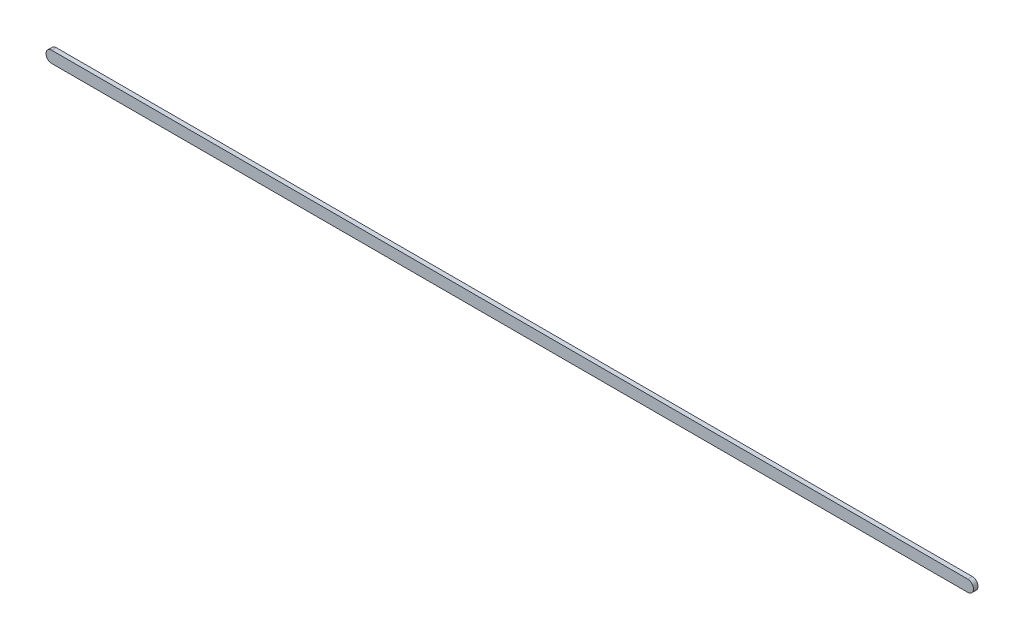
ISO-10303-21;
HEADER;
FILE_DESCRIPTION(('STEP AP214'),'2;1');
FILE_NAME('part.step','',(''),(''),'','','');
FILE_SCHEMA(('AUTOMOTIVE_DESIGN { 1 0 10303 214 1 1 1 1 }'));
ENDSEC;
DATA;
#1=APPLICATION_CONTEXT('core data for automotive mechanical design processes');
#2=APPLICATION_PROTOCOL_DEFINITION('international standard','automotive_design',2000,#1);
#3=PRODUCT_CONTEXT('',#1,'mechanical');
#4=PRODUCT('Part','Part','',(#3));
#5=PRODUCT_RELATED_PRODUCT_CATEGORY('part','',(#4));
#6=PRODUCT_DEFINITION_FORMATION('','',#4);
#7=PRODUCT_DEFINITION_CONTEXT('part definition',#1,'design');
#8=PRODUCT_DEFINITION('design','',#6,#7);
#9=PRODUCT_DEFINITION_SHAPE('','',#8);
#10=(LENGTH_UNIT() NAMED_UNIT(*) SI_UNIT(.MILLI.,.METRE.));
#11=(NAMED_UNIT(*) PLANE_ANGLE_UNIT() SI_UNIT($,.RADIAN.));
#12=(NAMED_UNIT(*) SI_UNIT($,.STERADIAN.) SOLID_ANGLE_UNIT());
#13=UNCERTAINTY_MEASURE_WITH_UNIT(LENGTH_MEASURE(1.E-05),#10,'distance_accuracy_value','');
#14=(GEOMETRIC_REPRESENTATION_CONTEXT(3) GLOBAL_UNCERTAINTY_ASSIGNED_CONTEXT((#13)) GLOBAL_UNIT_ASSIGNED_CONTEXT((#10,
#11,#12)) REPRESENTATION_CONTEXT('',''));
#15=CARTESIAN_POINT('',(0.,0.,0.));
#16=DIRECTION('',(0.,0.,1.));
#17=DIRECTION('',(1.,0.,0.));
#18=AXIS2_PLACEMENT_3D('',#15,#16,#17);
#19=CARTESIAN_POINT('',(111.379,121.2342,0.));
#20=DIRECTION('',(0.,1.,0.));
#21=DIRECTION('',(1.,0.,0.));
#22=AXIS2_PLACEMENT_3D('',#19,#20,#21);
#23=PLANE('',#22);
#24=DIRECTION('',(1.,0.,0.));
#25=VECTOR('',#24,1.);
#26=CARTESIAN_POINT('',(111.379,121.2342,0.1999996));
#27=LINE('',#26,#25);
#28=CARTESIAN_POINT('',(111.379,121.2342,0.1999996));
#29=VERTEX_POINT('',#28);
#30=CARTESIAN_POINT('',(151.8158,121.2342,0.1999996));
#31=VERTEX_POINT('',#30);
#32=EDGE_CURVE('E11',#29,#31,#27,.T.);
#33=ORIENTED_EDGE('',*,*,#32,.F.);
#34=DIRECTION('',(0.,0.,1.));
#35=VECTOR('',#34,1.);
#36=CARTESIAN_POINT('',(111.379,121.2342,0.));
#37=LINE('',#36,#35);
#38=CARTESIAN_POINT('',(111.379,121.2342,0.));
#39=VERTEX_POINT('',#38);
#40=EDGE_CURVE('E24',#39,#29,#37,.T.);
#41=ORIENTED_EDGE('',*,*,#40,.F.);
#42=DIRECTION('',(1.,0.,0.));
#43=VECTOR('',#42,1.);
#44=CARTESIAN_POINT('',(111.379,121.2342,0.));
#45=LINE('',#44,#43);
#46=CARTESIAN_POINT('',(151.8158,121.2342,0.));
#47=VERTEX_POINT('',#46);
#48=EDGE_CURVE('E75',#39,#47,#45,.T.);
#49=ORIENTED_EDGE('',*,*,#48,.T.);
#50=DIRECTION('',(0.,0.,1.));
#51=VECTOR('',#50,1.);
#52=CARTESIAN_POINT('',(151.8158,121.2342,0.));
#53=LINE('',#52,#51);
#54=EDGE_CURVE('E37',#47,#31,#53,.T.);
#55=ORIENTED_EDGE('',*,*,#54,.T.);
#56=EDGE_LOOP('',(#33,#41,#49,#55));
#57=FACE_BOUND('',#56,.T.);
#58=ADVANCED_FACE('F17',(#57),#23,.F.);
#59=CARTESIAN_POINT('',(151.8158,121.4882,0.));
#60=DIRECTION('',(0.,0.,-1.));
#61=DIRECTION('',(1.11896493820492E-13,-1.,0.));
#62=AXIS2_PLACEMENT_3D('',#59,#60,#61);
#63=CYLINDRICAL_SURFACE('',#62,0.254000000000005);
#64=CARTESIAN_POINT('',(151.8158,121.4882,0.1999996));
#65=DIRECTION('',(0.,0.,1.));
#66=DIRECTION('',(1.11896493820492E-13,-1.,0.));
#67=AXIS2_PLACEMENT_3D('',#64,#65,#66);
#68=CIRCLE('',#67,0.254000000000005);
#69=CARTESIAN_POINT('',(151.8158,121.7422,0.1999996));
#70=VERTEX_POINT('',#69);
#71=EDGE_CURVE('E83',#31,#70,#68,.T.);
#72=ORIENTED_EDGE('',*,*,#71,.F.);
#73=ORIENTED_EDGE('',*,*,#54,.F.);
#74=CARTESIAN_POINT('',(151.8158,121.4882,0.));
#75=DIRECTION('',(0.,0.,1.));
#76=DIRECTION('',(1.11896493820492E-13,-1.,0.));
#77=AXIS2_PLACEMENT_3D('',#74,#75,#76);
#78=CIRCLE('',#77,0.254000000000005);
#79=CARTESIAN_POINT('',(151.8158,121.7422,0.));
#80=VERTEX_POINT('',#79);
#81=EDGE_CURVE('E81',#47,#80,#78,.T.);
#82=ORIENTED_EDGE('',*,*,#81,.T.);
#83=DIRECTION('',(0.,0.,1.));
#84=VECTOR('',#83,1.);
#85=CARTESIAN_POINT('',(151.8158,121.7422,0.));
#86=LINE('',#85,#84);
#87=EDGE_CURVE('E67',#80,#70,#86,.T.);
#88=ORIENTED_EDGE('',*,*,#87,.T.);
#89=EDGE_LOOP('',(#72,#73,#82,#88));
#90=FACE_BOUND('',#89,.T.);
#91=ADVANCED_FACE('F89',(#90),#63,.T.);
#92=CARTESIAN_POINT('',(151.8158,121.7422,0.));
#93=DIRECTION('',(0.,-1.,0.));
#94=DIRECTION('',(-1.,0.,0.));
#95=AXIS2_PLACEMENT_3D('',#92,#93,#94);
#96=PLANE('',#95);
#97=DIRECTION('',(-1.,0.,0.));
#98=VECTOR('',#97,1.);
#99=CARTESIAN_POINT('',(151.8158,121.7422,0.1999996));
#100=LINE('',#99,#98);
#101=CARTESIAN_POINT('',(111.379,121.7422,0.1999996));
#102=VERTEX_POINT('',#101);
#103=EDGE_CURVE('E71',#70,#102,#100,.T.);
#104=ORIENTED_EDGE('',*,*,#103,.F.);
#105=ORIENTED_EDGE('',*,*,#87,.F.);
#106=DIRECTION('',(-1.,0.,0.));
#107=VECTOR('',#106,1.);
#108=CARTESIAN_POINT('',(151.8158,121.7422,0.));
#109=LINE('',#108,#107);
#110=CARTESIAN_POINT('',(111.379,121.7422,0.));
#111=VERTEX_POINT('',#110);
#112=EDGE_CURVE('E63',#80,#111,#109,.T.);
#113=ORIENTED_EDGE('',*,*,#112,.T.);
#114=DIRECTION('',(0.,0.,1.));
#115=VECTOR('',#114,1.);
#116=CARTESIAN_POINT('',(111.379,121.7422,0.));
#117=LINE('',#116,#115);
#118=EDGE_CURVE('E53',#111,#102,#117,.T.);
#119=ORIENTED_EDGE('',*,*,#118,.T.);
#120=EDGE_LOOP('',(#104,#105,#113,#119));
#121=FACE_BOUND('',#120,.T.);
#122=ADVANCED_FACE('F66',(#121),#96,.F.);
#123=CARTESIAN_POINT('',(111.379,121.4882,0.));
#124=DIRECTION('',(0.,0.,-1.));
#125=DIRECTION('',(0.,1.,0.));
#126=AXIS2_PLACEMENT_3D('',#123,#124,#125);
#127=CYLINDRICAL_SURFACE('',#126,0.254);
#128=CARTESIAN_POINT('',(111.379,121.4882,0.1999996));
#129=DIRECTION('',(0.,0.,1.));
#130=DIRECTION('',(0.,1.,0.));
#131=AXIS2_PLACEMENT_3D('',#128,#129,#130);
#132=CIRCLE('',#131,0.254);
#133=EDGE_CURVE('E59',#102,#29,#132,.T.);
#134=ORIENTED_EDGE('',*,*,#133,.F.);
#135=ORIENTED_EDGE('',*,*,#118,.F.);
#136=CARTESIAN_POINT('',(111.379,121.4882,0.));
#137=DIRECTION('',(0.,0.,1.));
#138=DIRECTION('',(0.,1.,0.));
#139=AXIS2_PLACEMENT_3D('',#136,#137,#138);
#140=CIRCLE('',#139,0.254);
#141=EDGE_CURVE('E57',#111,#39,#140,.T.);
#142=ORIENTED_EDGE('',*,*,#141,.T.);
#143=ORIENTED_EDGE('',*,*,#40,.T.);
#144=EDGE_LOOP('',(#134,#135,#142,#143));
#145=FACE_BOUND('',#144,.T.);
#146=ADVANCED_FACE('F55',(#145),#127,.T.);
#147=CARTESIAN_POINT('',(111.379,121.2342,0.));
#148=DIRECTION('',(0.,0.,-1.));
#149=DIRECTION('',(-1.,0.,0.));
#150=AXIS2_PLACEMENT_3D('',#147,#148,#149);
#151=PLANE('',#150);
#152=ORIENTED_EDGE('',*,*,#141,.F.);
#153=ORIENTED_EDGE('',*,*,#112,.F.);
#154=ORIENTED_EDGE('',*,*,#81,.F.);
#155=ORIENTED_EDGE('',*,*,#48,.F.);
#156=EDGE_LOOP('',(#152,#153,#154,#155));
#157=FACE_BOUND('',#156,.T.);
#158=ADVANCED_FACE('F74',(#157),#151,.T.);
#159=CARTESIAN_POINT('',(111.379,121.2342,0.1999996));
#160=DIRECTION('',(0.,0.,-1.));
#161=DIRECTION('',(-1.,0.,0.));
#162=AXIS2_PLACEMENT_3D('',#159,#160,#161);
#163=PLANE('',#162);
#164=ORIENTED_EDGE('',*,*,#32,.T.);
#165=ORIENTED_EDGE('',*,*,#71,.T.);
#166=ORIENTED_EDGE('',*,*,#103,.T.);
#167=ORIENTED_EDGE('',*,*,#133,.T.);
#168=EDGE_LOOP('',(#164,#165,#166,#167));
#169=FACE_BOUND('',#168,.T.);
#170=ADVANCED_FACE('F91',(#169),#163,.F.);
#171=CLOSED_SHELL('',(#58,#91,#122,#146,#158,#170));
#172=MANIFOLD_SOLID_BREP('B1',#171);
#173=ADVANCED_BREP_SHAPE_REPRESENTATION('',(#18,#172),#14);
#174=SHAPE_DEFINITION_REPRESENTATION(#9,#173);
ENDSEC;
END-ISO-10303-21;
